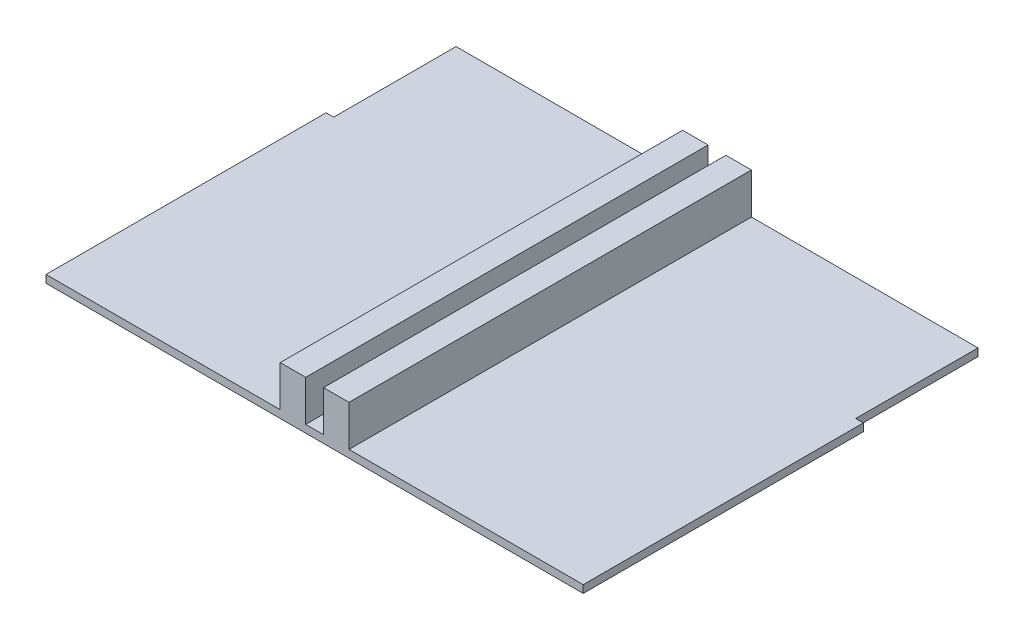
ISO-10303-21;
HEADER;
FILE_DESCRIPTION(('STEP AP214'),'2;1');
FILE_NAME('part.step','',(''),(''),'','','');
FILE_SCHEMA(('AUTOMOTIVE_DESIGN { 1 0 10303 214 1 1 1 1 }'));
ENDSEC;
DATA;
#1=APPLICATION_CONTEXT('core data for automotive mechanical design processes');
#2=APPLICATION_PROTOCOL_DEFINITION('international standard','automotive_design',2000,#1);
#3=PRODUCT_CONTEXT('',#1,'mechanical');
#4=PRODUCT('Part','Part','',(#3));
#5=PRODUCT_RELATED_PRODUCT_CATEGORY('part','',(#4));
#6=PRODUCT_DEFINITION_FORMATION('','',#4);
#7=PRODUCT_DEFINITION_CONTEXT('part definition',#1,'design');
#8=PRODUCT_DEFINITION('design','',#6,#7);
#9=PRODUCT_DEFINITION_SHAPE('','',#8);
#10=(LENGTH_UNIT() NAMED_UNIT(*) SI_UNIT(.MILLI.,.METRE.));
#11=(NAMED_UNIT(*) PLANE_ANGLE_UNIT() SI_UNIT($,.RADIAN.));
#12=(NAMED_UNIT(*) SI_UNIT($,.STERADIAN.) SOLID_ANGLE_UNIT());
#13=UNCERTAINTY_MEASURE_WITH_UNIT(LENGTH_MEASURE(1.E-05),#10,'distance_accuracy_value','');
#14=(GEOMETRIC_REPRESENTATION_CONTEXT(3) GLOBAL_UNCERTAINTY_ASSIGNED_CONTEXT((#13)) GLOBAL_UNIT_ASSIGNED_CONTEXT((#10,
#11,#12)) REPRESENTATION_CONTEXT('',''));
#15=CARTESIAN_POINT('',(0.,0.,0.));
#16=DIRECTION('',(0.,0.,1.));
#17=DIRECTION('',(1.,0.,0.));
#18=AXIS2_PLACEMENT_3D('',#15,#16,#17);
#19=CARTESIAN_POINT('',(0.,0.3,0.));
#20=DIRECTION('',(0.,1.,0.));
#21=DIRECTION('',(0.,0.,1.));
#22=AXIS2_PLACEMENT_3D('',#19,#20,#21);
#23=PLANE('',#22);
#24=DIRECTION('',(1.,0.,0.));
#25=VECTOR('',#24,1.);
#26=CARTESIAN_POINT('',(0.,0.3,0.));
#27=LINE('',#26,#25);
#28=CARTESIAN_POINT('',(-0.35,0.3,0.));
#29=VERTEX_POINT('',#28);
#30=CARTESIAN_POINT('',(0.349999999999999,0.3,0.));
#31=VERTEX_POINT('',#30);
#32=EDGE_CURVE('E57',#29,#31,#27,.T.);
#33=ORIENTED_EDGE('',*,*,#32,.T.);
#34=DIRECTION('',(0.,0.,1.));
#35=VECTOR('',#34,1.);
#36=CARTESIAN_POINT('',(0.349999999999999,0.3,-15.79));
#37=LINE('',#36,#35);
#38=CARTESIAN_POINT('',(0.350000000000002,0.3,-11.));
#39=VERTEX_POINT('',#38);
#40=EDGE_CURVE('E182',#39,#31,#37,.T.);
#41=ORIENTED_EDGE('',*,*,#40,.F.);
#42=DIRECTION('',(1.,0.,0.));
#43=VECTOR('',#42,1.);
#44=CARTESIAN_POINT('',(0.,0.3,-11.));
#45=LINE('',#44,#43);
#46=CARTESIAN_POINT('',(-0.35,0.3,-11.));
#47=VERTEX_POINT('',#46);
#48=EDGE_CURVE('E226',#47,#39,#45,.T.);
#49=ORIENTED_EDGE('',*,*,#48,.F.);
#50=DIRECTION('',(0.,0.,-1.));
#51=VECTOR('',#50,1.);
#52=CARTESIAN_POINT('',(-0.35,0.3,-15.79));
#53=LINE('',#52,#51);
#54=EDGE_CURVE('E183',#29,#47,#53,.T.);
#55=ORIENTED_EDGE('',*,*,#54,.F.);
#56=EDGE_LOOP('',(#33,#41,#49,#55));
#57=FACE_BOUND('',#56,.T.);
#58=ADVANCED_FACE('F34',(#57),#23,.T.);
#59=DIRECTION('',(1.,0.,0.));
#60=VECTOR('',#59,1.);
#61=CARTESIAN_POINT('',(0.,0.3,-15.79));
#62=LINE('',#61,#60);
#63=CARTESIAN_POINT('',(1.35000000000001,0.3,-15.79));
#64=VERTEX_POINT('',#63);
#65=CARTESIAN_POINT('',(10.24,0.3,-15.79));
#66=VERTEX_POINT('',#65);
#67=EDGE_CURVE('E224',#64,#66,#62,.T.);
#68=ORIENTED_EDGE('',*,*,#67,.F.);
#69=DIRECTION('',(0.,0.,-1.));
#70=VECTOR('',#69,1.);
#71=CARTESIAN_POINT('',(1.35,0.3,-15.79));
#72=LINE('',#71,#70);
#73=CARTESIAN_POINT('',(1.35000000000001,0.3,0.));
#74=VERTEX_POINT('',#73);
#75=EDGE_CURVE('E49',#74,#64,#72,.T.);
#76=ORIENTED_EDGE('',*,*,#75,.F.);
#77=CARTESIAN_POINT('',(10.54,0.3,0.));
#78=VERTEX_POINT('',#77);
#79=EDGE_CURVE('E216',#74,#78,#27,.T.);
#80=ORIENTED_EDGE('',*,*,#79,.T.);
#81=DIRECTION('',(0.,0.,-1.));
#82=VECTOR('',#81,1.);
#83=CARTESIAN_POINT('',(10.54,0.3,0.));
#84=LINE('',#83,#82);
#85=CARTESIAN_POINT('',(10.54,0.3,-10.99));
#86=VERTEX_POINT('',#85);
#87=EDGE_CURVE('E215',#78,#86,#84,.T.);
#88=ORIENTED_EDGE('',*,*,#87,.T.);
#89=DIRECTION('',(1.,0.,0.));
#90=VECTOR('',#89,1.);
#91=CARTESIAN_POINT('',(0.,0.3,-10.99));
#92=LINE('',#91,#90);
#93=CARTESIAN_POINT('',(10.24,0.3,-10.99));
#94=VERTEX_POINT('',#93);
#95=EDGE_CURVE('E218',#94,#86,#92,.T.);
#96=ORIENTED_EDGE('',*,*,#95,.F.);
#97=DIRECTION('',(0.,0.,1.));
#98=VECTOR('',#97,1.);
#99=CARTESIAN_POINT('',(10.24,0.3,0.));
#100=LINE('',#99,#98);
#101=EDGE_CURVE('E221',#66,#94,#100,.T.);
#102=ORIENTED_EDGE('',*,*,#101,.F.);
#103=EDGE_LOOP('',(#68,#76,#80,#88,#96,#102));
#104=FACE_BOUND('',#103,.T.);
#105=ADVANCED_FACE('F310',(#104),#23,.T.);
#106=CARTESIAN_POINT('',(0.,0.3,0.));
#107=DIRECTION('',(0.,0.,-1.));
#108=DIRECTION('',(-1.,0.,0.));
#109=AXIS2_PLACEMENT_3D('',#106,#107,#108);
#110=PLANE('',#109);
#111=DIRECTION('',(1.,0.,0.));
#112=VECTOR('',#111,1.);
#113=CARTESIAN_POINT('',(0.,0.,0.));
#114=LINE('',#113,#112);
#115=CARTESIAN_POINT('',(-10.54,0.,0.));
#116=VERTEX_POINT('',#115);
#117=CARTESIAN_POINT('',(10.54,0.,0.));
#118=VERTEX_POINT('',#117);
#119=EDGE_CURVE('E212',#116,#118,#114,.T.);
#120=ORIENTED_EDGE('',*,*,#119,.T.);
#121=DIRECTION('',(0.,-1.,0.));
#122=VECTOR('',#121,1.);
#123=CARTESIAN_POINT('',(10.54,0.3,0.));
#124=LINE('',#123,#122);
#125=EDGE_CURVE('E11',#78,#118,#124,.T.);
#126=ORIENTED_EDGE('',*,*,#125,.F.);
#127=ORIENTED_EDGE('',*,*,#79,.F.);
#128=DIRECTION('',(0.,-1.,0.));
#129=VECTOR('',#128,1.);
#130=CARTESIAN_POINT('',(1.35000000000001,1.9,0.));
#131=LINE('',#130,#129);
#132=CARTESIAN_POINT('',(1.35000000000001,1.9,0.));
#133=VERTEX_POINT('',#132);
#134=EDGE_CURVE('E166',#133,#74,#131,.T.);
#135=ORIENTED_EDGE('',*,*,#134,.F.);
#136=DIRECTION('',(1.,0.,0.));
#137=VECTOR('',#136,1.);
#138=CARTESIAN_POINT('',(0.35000000000001,1.9,0.));
#139=LINE('',#138,#137);
#140=CARTESIAN_POINT('',(0.35000000000001,1.9,0.));
#141=VERTEX_POINT('',#140);
#142=EDGE_CURVE('E160',#141,#133,#139,.T.);
#143=ORIENTED_EDGE('',*,*,#142,.F.);
#144=DIRECTION('',(0.,-1.,0.));
#145=VECTOR('',#144,1.);
#146=CARTESIAN_POINT('',(0.35000000000001,1.9,0.));
#147=LINE('',#146,#145);
#148=EDGE_CURVE('E164',#141,#31,#147,.T.);
#149=ORIENTED_EDGE('',*,*,#148,.T.);
#150=ORIENTED_EDGE('',*,*,#32,.F.);
#151=DIRECTION('',(0.,-1.,0.));
#152=VECTOR('',#151,1.);
#153=CARTESIAN_POINT('',(-0.35,1.9,0.));
#154=LINE('',#153,#152);
#155=CARTESIAN_POINT('',(-0.35,1.9,0.));
#156=VERTEX_POINT('',#155);
#157=EDGE_CURVE('E200',#156,#29,#154,.T.);
#158=ORIENTED_EDGE('',*,*,#157,.F.);
#159=DIRECTION('',(1.,0.,0.));
#160=VECTOR('',#159,1.);
#161=CARTESIAN_POINT('',(-0.35,1.9,0.));
#162=LINE('',#161,#160);
#163=CARTESIAN_POINT('',(-1.35,1.9,0.));
#164=VERTEX_POINT('',#163);
#165=EDGE_CURVE('E199',#164,#156,#162,.T.);
#166=ORIENTED_EDGE('',*,*,#165,.F.);
#167=DIRECTION('',(0.,-1.,0.));
#168=VECTOR('',#167,1.);
#169=CARTESIAN_POINT('',(-1.35,1.9,0.));
#170=LINE('',#169,#168);
#171=CARTESIAN_POINT('',(-1.35,0.3,0.));
#172=VERTEX_POINT('',#171);
#173=EDGE_CURVE('E206',#164,#172,#170,.T.);
#174=ORIENTED_EDGE('',*,*,#173,.T.);
#175=CARTESIAN_POINT('',(-10.54,0.3,0.));
#176=VERTEX_POINT('',#175);
#177=EDGE_CURVE('E213',#176,#172,#27,.T.);
#178=ORIENTED_EDGE('',*,*,#177,.F.);
#179=DIRECTION('',(0.,-1.,0.));
#180=VECTOR('',#179,1.);
#181=CARTESIAN_POINT('',(-10.54,0.3,0.));
#182=LINE('',#181,#180);
#183=EDGE_CURVE('E239',#176,#116,#182,.T.);
#184=ORIENTED_EDGE('',*,*,#183,.T.);
#185=EDGE_LOOP('',(#120,#126,#127,#135,#143,#149,#150,#158,#166,#174,#178,#184));
#186=FACE_BOUND('',#185,.T.);
#187=ADVANCED_FACE('F36',(#186),#110,.F.);
#188=CARTESIAN_POINT('',(10.54,0.3,0.));
#189=DIRECTION('',(-1.,0.,0.));
#190=DIRECTION('',(0.,0.,1.));
#191=AXIS2_PLACEMENT_3D('',#188,#189,#190);
#192=PLANE('',#191);
#193=DIRECTION('',(0.,0.,-1.));
#194=VECTOR('',#193,1.);
#195=CARTESIAN_POINT('',(10.54,0.,0.));
#196=LINE('',#195,#194);
#197=CARTESIAN_POINT('',(10.54,0.,-10.99));
#198=VERTEX_POINT('',#197);
#199=EDGE_CURVE('E241',#118,#198,#196,.T.);
#200=ORIENTED_EDGE('',*,*,#199,.T.);
#201=DIRECTION('',(0.,-1.,0.));
#202=VECTOR('',#201,1.);
#203=CARTESIAN_POINT('',(10.54,0.3,-10.99));
#204=LINE('',#203,#202);
#205=EDGE_CURVE('E42',#86,#198,#204,.T.);
#206=ORIENTED_EDGE('',*,*,#205,.F.);
#207=ORIENTED_EDGE('',*,*,#87,.F.);
#208=ORIENTED_EDGE('',*,*,#125,.T.);
#209=EDGE_LOOP('',(#200,#206,#207,#208));
#210=FACE_BOUND('',#209,.T.);
#211=ADVANCED_FACE('F298',(#210),#192,.F.);
#212=CARTESIAN_POINT('',(0.,0.3,-10.99));
#213=DIRECTION('',(0.,0.,-1.));
#214=DIRECTION('',(-1.,0.,0.));
#215=AXIS2_PLACEMENT_3D('',#212,#213,#214);
#216=PLANE('',#215);
#217=DIRECTION('',(1.,0.,0.));
#218=VECTOR('',#217,1.);
#219=CARTESIAN_POINT('',(0.,0.,-10.99));
#220=LINE('',#219,#218);
#221=CARTESIAN_POINT('',(10.24,0.,-10.99));
#222=VERTEX_POINT('',#221);
#223=EDGE_CURVE('E244',#222,#198,#220,.T.);
#224=ORIENTED_EDGE('',*,*,#223,.F.);
#225=DIRECTION('',(0.,-1.,0.));
#226=VECTOR('',#225,1.);
#227=CARTESIAN_POINT('',(10.24,0.3,-10.99));
#228=LINE('',#227,#226);
#229=EDGE_CURVE('E290',#94,#222,#228,.T.);
#230=ORIENTED_EDGE('',*,*,#229,.F.);
#231=ORIENTED_EDGE('',*,*,#95,.T.);
#232=ORIENTED_EDGE('',*,*,#205,.T.);
#233=EDGE_LOOP('',(#224,#230,#231,#232));
#234=FACE_BOUND('',#233,.T.);
#235=ADVANCED_FACE('F294',(#234),#216,.T.);
#236=CARTESIAN_POINT('',(10.24,0.3,0.));
#237=DIRECTION('',(1.,0.,0.));
#238=DIRECTION('',(0.,0.,-1.));
#239=AXIS2_PLACEMENT_3D('',#236,#237,#238);
#240=PLANE('',#239);
#241=DIRECTION('',(0.,0.,1.));
#242=VECTOR('',#241,1.);
#243=CARTESIAN_POINT('',(10.24,0.,0.));
#244=LINE('',#243,#242);
#245=CARTESIAN_POINT('',(10.24,0.,-15.79));
#246=VERTEX_POINT('',#245);
#247=EDGE_CURVE('E247',#246,#222,#244,.T.);
#248=ORIENTED_EDGE('',*,*,#247,.F.);
#249=DIRECTION('',(0.,-1.,0.));
#250=VECTOR('',#249,1.);
#251=CARTESIAN_POINT('',(10.24,0.3,-15.79));
#252=LINE('',#251,#250);
#253=EDGE_CURVE('E288',#66,#246,#252,.T.);
#254=ORIENTED_EDGE('',*,*,#253,.F.);
#255=ORIENTED_EDGE('',*,*,#101,.T.);
#256=ORIENTED_EDGE('',*,*,#229,.T.);
#257=EDGE_LOOP('',(#248,#254,#255,#256));
#258=FACE_BOUND('',#257,.T.);
#259=ADVANCED_FACE('F308',(#258),#240,.T.);
#260=CARTESIAN_POINT('',(0.,0.3,-15.79));
#261=DIRECTION('',(0.,0.,-1.));
#262=DIRECTION('',(-1.,0.,0.));
#263=AXIS2_PLACEMENT_3D('',#260,#261,#262);
#264=PLANE('',#263);
#265=DIRECTION('',(1.,0.,0.));
#266=VECTOR('',#265,1.);
#267=CARTESIAN_POINT('',(0.,0.,-15.79));
#268=LINE('',#267,#266);
#269=CARTESIAN_POINT('',(0.35,0.,-15.79));
#270=VERTEX_POINT('',#269);
#271=EDGE_CURVE('E250',#270,#246,#268,.T.);
#272=ORIENTED_EDGE('',*,*,#271,.F.);
#273=DIRECTION('',(0.,-1.,0.));
#274=VECTOR('',#273,1.);
#275=CARTESIAN_POINT('',(0.35,0.3,-15.79));
#276=LINE('',#275,#274);
#277=CARTESIAN_POINT('',(0.349999999999999,1.9,-15.79));
#278=VERTEX_POINT('',#277);
#279=EDGE_CURVE('E286',#278,#270,#276,.T.);
#280=ORIENTED_EDGE('',*,*,#279,.F.);
#281=DIRECTION('',(-1.,0.,0.));
#282=VECTOR('',#281,1.);
#283=CARTESIAN_POINT('',(0.349999999999999,1.9,-15.79));
#284=LINE('',#283,#282);
#285=CARTESIAN_POINT('',(1.35,1.9,-15.79));
#286=VERTEX_POINT('',#285);
#287=EDGE_CURVE('E176',#286,#278,#284,.T.);
#288=ORIENTED_EDGE('',*,*,#287,.F.);
#289=DIRECTION('',(0.,-1.,0.));
#290=VECTOR('',#289,1.);
#291=CARTESIAN_POINT('',(1.35,1.9,-15.79));
#292=LINE('',#291,#290);
#293=EDGE_CURVE('E188',#286,#64,#292,.T.);
#294=ORIENTED_EDGE('',*,*,#293,.T.);
#295=ORIENTED_EDGE('',*,*,#67,.T.);
#296=ORIENTED_EDGE('',*,*,#253,.T.);
#297=EDGE_LOOP('',(#272,#280,#288,#294,#295,#296));
#298=FACE_BOUND('',#297,.T.);
#299=ADVANCED_FACE('F338',(#298),#264,.T.);
#300=CARTESIAN_POINT('',(0.35,0.3,0.));
#301=DIRECTION('',(1.,0.,0.));
#302=DIRECTION('',(0.,0.,-1.));
#303=AXIS2_PLACEMENT_3D('',#300,#301,#302);
#304=PLANE('',#303);
#305=DIRECTION('',(0.,0.,1.));
#306=VECTOR('',#305,1.);
#307=CARTESIAN_POINT('',(0.35,0.,0.));
#308=LINE('',#307,#306);
#309=CARTESIAN_POINT('',(0.35,0.,-11.));
#310=VERTEX_POINT('',#309);
#311=EDGE_CURVE('E253',#270,#310,#308,.T.);
#312=ORIENTED_EDGE('',*,*,#311,.T.);
#313=DIRECTION('',(0.,-1.,0.));
#314=VECTOR('',#313,1.);
#315=CARTESIAN_POINT('',(0.35,0.3,-11.));
#316=LINE('',#315,#314);
#317=EDGE_CURVE('E284',#39,#310,#316,.T.);
#318=ORIENTED_EDGE('',*,*,#317,.F.);
#319=ORIENTED_EDGE('',*,*,#40,.T.);
#320=ORIENTED_EDGE('',*,*,#148,.F.);
#321=DIRECTION('',(0.,0.,1.));
#322=VECTOR('',#321,1.);
#323=CARTESIAN_POINT('',(0.349999999999999,1.9,-15.79));
#324=LINE('',#323,#322);
#325=EDGE_CURVE('E170',#278,#141,#324,.T.);
#326=ORIENTED_EDGE('',*,*,#325,.F.);
#327=ORIENTED_EDGE('',*,*,#279,.T.);
#328=EDGE_LOOP('',(#312,#318,#319,#320,#326,#327));
#329=FACE_BOUND('',#328,.T.);
#330=ADVANCED_FACE('F180',(#329),#304,.F.);
#331=CARTESIAN_POINT('',(0.,0.3,-11.));
#332=DIRECTION('',(0.,0.,-1.));
#333=DIRECTION('',(-1.,0.,0.));
#334=AXIS2_PLACEMENT_3D('',#331,#332,#333);
#335=PLANE('',#334);
#336=DIRECTION('',(1.,0.,0.));
#337=VECTOR('',#336,1.);
#338=CARTESIAN_POINT('',(0.,0.,-11.));
#339=LINE('',#338,#337);
#340=CARTESIAN_POINT('',(-0.35,0.,-11.));
#341=VERTEX_POINT('',#340);
#342=EDGE_CURVE('E255',#341,#310,#339,.T.);
#343=ORIENTED_EDGE('',*,*,#342,.F.);
#344=DIRECTION('',(0.,-1.,0.));
#345=VECTOR('',#344,1.);
#346=CARTESIAN_POINT('',(-0.35,0.3,-11.));
#347=LINE('',#346,#345);
#348=EDGE_CURVE('E282',#47,#341,#347,.T.);
#349=ORIENTED_EDGE('',*,*,#348,.F.);
#350=ORIENTED_EDGE('',*,*,#48,.T.);
#351=ORIENTED_EDGE('',*,*,#317,.T.);
#352=EDGE_LOOP('',(#343,#349,#350,#351));
#353=FACE_BOUND('',#352,.T.);
#354=ADVANCED_FACE('F335',(#353),#335,.T.);
#355=CARTESIAN_POINT('',(-0.35,0.3,0.));
#356=DIRECTION('',(1.,0.,0.));
#357=DIRECTION('',(0.,0.,-1.));
#358=AXIS2_PLACEMENT_3D('',#355,#356,#357);
#359=PLANE('',#358);
#360=DIRECTION('',(0.,0.,1.));
#361=VECTOR('',#360,1.);
#362=CARTESIAN_POINT('',(-0.35,0.,0.));
#363=LINE('',#362,#361);
#364=CARTESIAN_POINT('',(-0.35,0.,-15.79));
#365=VERTEX_POINT('',#364);
#366=EDGE_CURVE('E258',#365,#341,#363,.T.);
#367=ORIENTED_EDGE('',*,*,#366,.F.);
#368=DIRECTION('',(0.,-1.,0.));
#369=VECTOR('',#368,1.);
#370=CARTESIAN_POINT('',(-0.35,0.3,-15.79));
#371=LINE('',#370,#369);
#372=CARTESIAN_POINT('',(-0.35,1.9,-15.79));
#373=VERTEX_POINT('',#372);
#374=EDGE_CURVE('E280',#373,#365,#371,.T.);
#375=ORIENTED_EDGE('',*,*,#374,.F.);
#376=DIRECTION('',(0.,0.,-1.));
#377=VECTOR('',#376,1.);
#378=CARTESIAN_POINT('',(-0.35,1.9,-15.79));
#379=LINE('',#378,#377);
#380=EDGE_CURVE('E192',#156,#373,#379,.T.);
#381=ORIENTED_EDGE('',*,*,#380,.F.);
#382=ORIENTED_EDGE('',*,*,#157,.T.);
#383=ORIENTED_EDGE('',*,*,#54,.T.);
#384=ORIENTED_EDGE('',*,*,#348,.T.);
#385=EDGE_LOOP('',(#367,#375,#381,#382,#383,#384));
#386=FACE_BOUND('',#385,.T.);
#387=ADVANCED_FACE('F332',(#386),#359,.T.);
#388=CARTESIAN_POINT('',(0.,0.3,-15.79));
#389=DIRECTION('',(0.,0.,-1.));
#390=DIRECTION('',(-1.,0.,0.));
#391=AXIS2_PLACEMENT_3D('',#388,#389,#390);
#392=PLANE('',#391);
#393=DIRECTION('',(1.,0.,0.));
#394=VECTOR('',#393,1.);
#395=CARTESIAN_POINT('',(0.,0.,-15.79));
#396=LINE('',#395,#394);
#397=CARTESIAN_POINT('',(-10.24,0.,-15.79));
#398=VERTEX_POINT('',#397);
#399=EDGE_CURVE('E261',#398,#365,#396,.T.);
#400=ORIENTED_EDGE('',*,*,#399,.F.);
#401=DIRECTION('',(0.,-1.,0.));
#402=VECTOR('',#401,1.);
#403=CARTESIAN_POINT('',(-10.24,0.3,-15.79));
#404=LINE('',#403,#402);
#405=CARTESIAN_POINT('',(-10.24,0.3,-15.79));
#406=VERTEX_POINT('',#405);
#407=EDGE_CURVE('E278',#406,#398,#404,.T.);
#408=ORIENTED_EDGE('',*,*,#407,.F.);
#409=DIRECTION('',(1.,0.,0.));
#410=VECTOR('',#409,1.);
#411=CARTESIAN_POINT('',(0.,0.3,-15.79));
#412=LINE('',#411,#410);
#413=CARTESIAN_POINT('',(-1.35,0.3,-15.79));
#414=VERTEX_POINT('',#413);
#415=EDGE_CURVE('E228',#406,#414,#412,.T.);
#416=ORIENTED_EDGE('',*,*,#415,.T.);
#417=DIRECTION('',(0.,-1.,0.));
#418=VECTOR('',#417,1.);
#419=CARTESIAN_POINT('',(-1.35,1.9,-15.79));
#420=LINE('',#419,#418);
#421=CARTESIAN_POINT('',(-1.35,1.9,-15.79));
#422=VERTEX_POINT('',#421);
#423=EDGE_CURVE('E209',#422,#414,#420,.T.);
#424=ORIENTED_EDGE('',*,*,#423,.F.);
#425=DIRECTION('',(-1.,0.,0.));
#426=VECTOR('',#425,1.);
#427=CARTESIAN_POINT('',(-0.35,1.9,-15.79));
#428=LINE('',#427,#426);
#429=EDGE_CURVE('E195',#373,#422,#428,.T.);
#430=ORIENTED_EDGE('',*,*,#429,.F.);
#431=ORIENTED_EDGE('',*,*,#374,.T.);
#432=EDGE_LOOP('',(#400,#408,#416,#424,#430,#431));
#433=FACE_BOUND('',#432,.T.);
#434=ADVANCED_FACE('F325',(#433),#392,.T.);
#435=CARTESIAN_POINT('',(-10.24,0.3,0.));
#436=DIRECTION('',(1.,0.,0.));
#437=DIRECTION('',(0.,0.,-1.));
#438=AXIS2_PLACEMENT_3D('',#435,#436,#437);
#439=PLANE('',#438);
#440=DIRECTION('',(0.,0.,1.));
#441=VECTOR('',#440,1.);
#442=CARTESIAN_POINT('',(-10.24,0.,0.));
#443=LINE('',#442,#441);
#444=CARTESIAN_POINT('',(-10.24,0.,-10.99));
#445=VERTEX_POINT('',#444);
#446=EDGE_CURVE('E264',#398,#445,#443,.T.);
#447=ORIENTED_EDGE('',*,*,#446,.T.);
#448=DIRECTION('',(0.,-1.,0.));
#449=VECTOR('',#448,1.);
#450=CARTESIAN_POINT('',(-10.24,0.3,-10.99));
#451=LINE('',#450,#449);
#452=CARTESIAN_POINT('',(-10.24,0.3,-10.99));
#453=VERTEX_POINT('',#452);
#454=EDGE_CURVE('E276',#453,#445,#451,.T.);
#455=ORIENTED_EDGE('',*,*,#454,.F.);
#456=DIRECTION('',(0.,0.,1.));
#457=VECTOR('',#456,1.);
#458=CARTESIAN_POINT('',(-10.24,0.3,0.));
#459=LINE('',#458,#457);
#460=EDGE_CURVE('E231',#406,#453,#459,.T.);
#461=ORIENTED_EDGE('',*,*,#460,.F.);
#462=ORIENTED_EDGE('',*,*,#407,.T.);
#463=EDGE_LOOP('',(#447,#455,#461,#462));
#464=FACE_BOUND('',#463,.T.);
#465=ADVANCED_FACE('F379',(#464),#439,.F.);
#466=CARTESIAN_POINT('',(0.,0.3,-10.99));
#467=DIRECTION('',(0.,0.,-1.));
#468=DIRECTION('',(-1.,0.,0.));
#469=AXIS2_PLACEMENT_3D('',#466,#467,#468);
#470=PLANE('',#469);
#471=DIRECTION('',(1.,0.,0.));
#472=VECTOR('',#471,1.);
#473=CARTESIAN_POINT('',(0.,0.,-10.99));
#474=LINE('',#473,#472);
#475=CARTESIAN_POINT('',(-10.54,0.,-10.99));
#476=VERTEX_POINT('',#475);
#477=EDGE_CURVE('E267',#476,#445,#474,.T.);
#478=ORIENTED_EDGE('',*,*,#477,.F.);
#479=DIRECTION('',(0.,-1.,0.));
#480=VECTOR('',#479,1.);
#481=CARTESIAN_POINT('',(-10.54,0.3,-10.99));
#482=LINE('',#481,#480);
#483=CARTESIAN_POINT('',(-10.54,0.3,-10.99));
#484=VERTEX_POINT('',#483);
#485=EDGE_CURVE('E274',#484,#476,#482,.T.);
#486=ORIENTED_EDGE('',*,*,#485,.F.);
#487=DIRECTION('',(1.,0.,0.));
#488=VECTOR('',#487,1.);
#489=CARTESIAN_POINT('',(0.,0.3,-10.99));
#490=LINE('',#489,#488);
#491=EDGE_CURVE('E233',#484,#453,#490,.T.);
#492=ORIENTED_EDGE('',*,*,#491,.T.);
#493=ORIENTED_EDGE('',*,*,#454,.T.);
#494=EDGE_LOOP('',(#478,#486,#492,#493));
#495=FACE_BOUND('',#494,.T.);
#496=ADVANCED_FACE('F319',(#495),#470,.T.);
#497=CARTESIAN_POINT('',(-10.54,0.3,0.));
#498=DIRECTION('',(-1.,0.,0.));
#499=DIRECTION('',(0.,0.,1.));
#500=AXIS2_PLACEMENT_3D('',#497,#498,#499);
#501=PLANE('',#500);
#502=DIRECTION('',(0.,0.,-1.));
#503=VECTOR('',#502,1.);
#504=CARTESIAN_POINT('',(-10.54,0.,0.));
#505=LINE('',#504,#503);
#506=EDGE_CURVE('E270',#116,#476,#505,.T.);
#507=ORIENTED_EDGE('',*,*,#506,.F.);
#508=ORIENTED_EDGE('',*,*,#183,.F.);
#509=DIRECTION('',(0.,0.,-1.));
#510=VECTOR('',#509,1.);
#511=CARTESIAN_POINT('',(-10.54,0.3,0.));
#512=LINE('',#511,#510);
#513=EDGE_CURVE('E236',#176,#484,#512,.T.);
#514=ORIENTED_EDGE('',*,*,#513,.T.);
#515=ORIENTED_EDGE('',*,*,#485,.T.);
#516=EDGE_LOOP('',(#507,#508,#514,#515));
#517=FACE_BOUND('',#516,.T.);
#518=ADVANCED_FACE('F314',(#517),#501,.T.);
#519=DIRECTION('',(0.,0.,1.));
#520=VECTOR('',#519,1.);
#521=CARTESIAN_POINT('',(-1.35,0.3,-15.79));
#522=LINE('',#521,#520);
#523=EDGE_CURVE('E186',#414,#172,#522,.T.);
#524=ORIENTED_EDGE('',*,*,#523,.F.);
#525=ORIENTED_EDGE('',*,*,#415,.F.);
#526=ORIENTED_EDGE('',*,*,#460,.T.);
#527=ORIENTED_EDGE('',*,*,#491,.F.);
#528=ORIENTED_EDGE('',*,*,#513,.F.);
#529=ORIENTED_EDGE('',*,*,#177,.T.);
#530=EDGE_LOOP('',(#524,#525,#526,#527,#528,#529));
#531=FACE_BOUND('',#530,.T.);
#532=ADVANCED_FACE('F360',(#531),#23,.T.);
#533=CARTESIAN_POINT('',(0.,0.,0.));
#534=DIRECTION('',(0.,1.,0.));
#535=DIRECTION('',(0.,0.,1.));
#536=AXIS2_PLACEMENT_3D('',#533,#534,#535);
#537=PLANE('',#536);
#538=ORIENTED_EDGE('',*,*,#119,.F.);
#539=ORIENTED_EDGE('',*,*,#506,.T.);
#540=ORIENTED_EDGE('',*,*,#477,.T.);
#541=ORIENTED_EDGE('',*,*,#446,.F.);
#542=ORIENTED_EDGE('',*,*,#399,.T.);
#543=ORIENTED_EDGE('',*,*,#366,.T.);
#544=ORIENTED_EDGE('',*,*,#342,.T.);
#545=ORIENTED_EDGE('',*,*,#311,.F.);
#546=ORIENTED_EDGE('',*,*,#271,.T.);
#547=ORIENTED_EDGE('',*,*,#247,.T.);
#548=ORIENTED_EDGE('',*,*,#223,.T.);
#549=ORIENTED_EDGE('',*,*,#199,.F.);
#550=EDGE_LOOP('',(#538,#539,#540,#541,#542,#543,#544,#545,#546,#547,#548,#549));
#551=FACE_BOUND('',#550,.T.);
#552=ADVANCED_FACE('F302',(#551),#537,.F.);
#553=CARTESIAN_POINT('',(-1.35,1.9,-15.79));
#554=DIRECTION('',(1.,0.,0.));
#555=DIRECTION('',(0.,0.,-1.));
#556=AXIS2_PLACEMENT_3D('',#553,#554,#555);
#557=PLANE('',#556);
#558=ORIENTED_EDGE('',*,*,#523,.T.);
#559=ORIENTED_EDGE('',*,*,#173,.F.);
#560=DIRECTION('',(0.,0.,1.));
#561=VECTOR('',#560,1.);
#562=CARTESIAN_POINT('',(-1.35,1.9,-15.79));
#563=LINE('',#562,#561);
#564=EDGE_CURVE('E197',#422,#164,#563,.T.);
#565=ORIENTED_EDGE('',*,*,#564,.F.);
#566=ORIENTED_EDGE('',*,*,#423,.T.);
#567=EDGE_LOOP('',(#558,#559,#565,#566));
#568=FACE_BOUND('',#567,.T.);
#569=ADVANCED_FACE('F355',(#568),#557,.F.);
#570=CARTESIAN_POINT('',(0.,1.9,0.));
#571=DIRECTION('',(0.,-1.,0.));
#572=DIRECTION('',(0.,0.,-1.));
#573=AXIS2_PLACEMENT_3D('',#570,#571,#572);
#574=PLANE('',#573);
#575=ORIENTED_EDGE('',*,*,#380,.T.);
#576=ORIENTED_EDGE('',*,*,#429,.T.);
#577=ORIENTED_EDGE('',*,*,#564,.T.);
#578=ORIENTED_EDGE('',*,*,#165,.T.);
#579=EDGE_LOOP('',(#575,#576,#577,#578));
#580=FACE_BOUND('',#579,.T.);
#581=ADVANCED_FACE('F348',(#580),#574,.F.);
#582=CARTESIAN_POINT('',(1.35,1.9,-15.79));
#583=DIRECTION('',(-1.,0.,0.));
#584=DIRECTION('',(0.,0.,1.));
#585=AXIS2_PLACEMENT_3D('',#582,#583,#584);
#586=PLANE('',#585);
#587=ORIENTED_EDGE('',*,*,#75,.T.);
#588=ORIENTED_EDGE('',*,*,#293,.F.);
#589=DIRECTION('',(0.,0.,-1.));
#590=VECTOR('',#589,1.);
#591=CARTESIAN_POINT('',(1.35,1.9,-15.79));
#592=LINE('',#591,#590);
#593=EDGE_CURVE('E169',#133,#286,#592,.T.);
#594=ORIENTED_EDGE('',*,*,#593,.F.);
#595=ORIENTED_EDGE('',*,*,#134,.T.);
#596=EDGE_LOOP('',(#587,#588,#594,#595));
#597=FACE_BOUND('',#596,.T.);
#598=ADVANCED_FACE('F342',(#597),#586,.F.);
#599=CARTESIAN_POINT('',(0.,1.9,0.));
#600=DIRECTION('',(0.,1.,0.));
#601=DIRECTION('',(0.,0.,1.));
#602=AXIS2_PLACEMENT_3D('',#599,#600,#601);
#603=PLANE('',#602);
#604=ORIENTED_EDGE('',*,*,#325,.T.);
#605=ORIENTED_EDGE('',*,*,#142,.T.);
#606=ORIENTED_EDGE('',*,*,#593,.T.);
#607=ORIENTED_EDGE('',*,*,#287,.T.);
#608=EDGE_LOOP('',(#604,#605,#606,#607));
#609=FACE_BOUND('',#608,.T.);
#610=ADVANCED_FACE('F174',(#609),#603,.T.);
#611=CLOSED_SHELL('',(#58,#105,#187,#211,#235,#259,#299,#330,#354,#387,#434,#465,#496,#518,#532,
#552,#569,#581,#598,#610));
#612=MANIFOLD_SOLID_BREP('B2',#611);
#613=ADVANCED_BREP_SHAPE_REPRESENTATION('',(#18,#612),#14);
#614=SHAPE_DEFINITION_REPRESENTATION(#9,#613);
ENDSEC;
END-ISO-10303-21;
